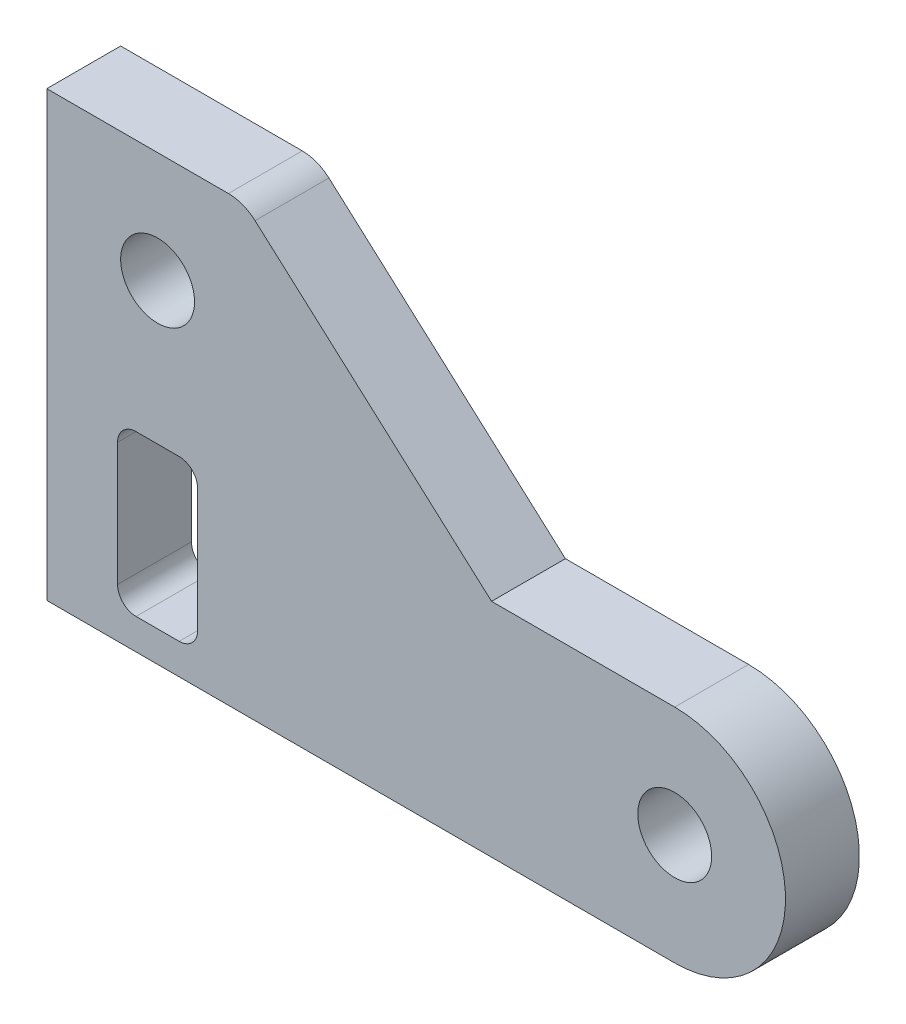
ISO-10303-21;
HEADER;
FILE_DESCRIPTION(('STEP AP214'),'2;1');
FILE_NAME('part.step','',(''),(''),'','','');
FILE_SCHEMA(('AUTOMOTIVE_DESIGN { 1 0 10303 214 1 1 1 1 }'));
ENDSEC;
DATA;
#1=APPLICATION_CONTEXT('core data for automotive mechanical design processes');
#2=APPLICATION_PROTOCOL_DEFINITION('international standard','automotive_design',2000,#1);
#3=PRODUCT_CONTEXT('',#1,'mechanical');
#4=PRODUCT('Part','Part','',(#3));
#5=PRODUCT_RELATED_PRODUCT_CATEGORY('part','',(#4));
#6=PRODUCT_DEFINITION_FORMATION('','',#4);
#7=PRODUCT_DEFINITION_CONTEXT('part definition',#1,'design');
#8=PRODUCT_DEFINITION('design','',#6,#7);
#9=PRODUCT_DEFINITION_SHAPE('','',#8);
#10=(LENGTH_UNIT() NAMED_UNIT(*) SI_UNIT(.MILLI.,.METRE.));
#11=(NAMED_UNIT(*) PLANE_ANGLE_UNIT() SI_UNIT($,.RADIAN.));
#12=(NAMED_UNIT(*) SI_UNIT($,.STERADIAN.) SOLID_ANGLE_UNIT());
#13=UNCERTAINTY_MEASURE_WITH_UNIT(LENGTH_MEASURE(1.E-05),#10,'distance_accuracy_value','');
#14=(GEOMETRIC_REPRESENTATION_CONTEXT(3) GLOBAL_UNCERTAINTY_ASSIGNED_CONTEXT((#13)) GLOBAL_UNIT_ASSIGNED_CONTEXT((#10,
#11,#12)) REPRESENTATION_CONTEXT('',''));
#15=CARTESIAN_POINT('',(0.,0.,0.));
#16=DIRECTION('',(0.,0.,1.));
#17=DIRECTION('',(1.,0.,0.));
#18=AXIS2_PLACEMENT_3D('',#15,#16,#17);
#19=CARTESIAN_POINT('',(201.0978533093,269.1465473352,3.));
#20=DIRECTION('',(0.,0.,1.));
#21=DIRECTION('',(1.,0.,0.));
#22=AXIS2_PLACEMENT_3D('',#19,#20,#21);
#23=PLANE('',#22);
#24=DIRECTION('',(1.,0.,0.));
#25=VECTOR('',#24,1.);
#26=CARTESIAN_POINT('',(179.2228533093,265.8965473352,3.));
#27=LINE('',#26,#25);
#28=CARTESIAN_POINT('',(179.2228533093,265.8965473352,3.));
#29=VERTEX_POINT('',#28);
#30=CARTESIAN_POINT('',(180.9728533093,265.8965473352,3.));
#31=VERTEX_POINT('',#30);
#32=EDGE_CURVE('E148',#29,#31,#27,.T.);
#33=ORIENTED_EDGE('',*,*,#32,.F.);
#34=CARTESIAN_POINT('',(179.2228533093,266.6465473352,3.));
#35=DIRECTION('',(0.,0.,1.));
#36=DIRECTION('',(1.,0.,0.));
#37=AXIS2_PLACEMENT_3D('',#34,#35,#36);
#38=CIRCLE('',#37,0.749999999999987);
#39=CARTESIAN_POINT('',(178.4728533093,266.6465473352,3.));
#40=VERTEX_POINT('',#39);
#41=EDGE_CURVE('E140',#40,#29,#38,.T.);
#42=ORIENTED_EDGE('',*,*,#41,.F.);
#43=DIRECTION('',(0.,-1.,0.));
#44=VECTOR('',#43,1.);
#45=CARTESIAN_POINT('',(178.4728533093,271.6465473352,3.));
#46=LINE('',#45,#44);
#47=CARTESIAN_POINT('',(178.4728533093,271.6465473352,3.));
#48=VERTEX_POINT('',#47);
#49=EDGE_CURVE('E175',#48,#40,#46,.T.);
#50=ORIENTED_EDGE('',*,*,#49,.F.);
#51=CARTESIAN_POINT('',(179.2228533093,271.6465473352,3.));
#52=DIRECTION('',(0.,0.,1.));
#53=DIRECTION('',(1.,0.,0.));
#54=AXIS2_PLACEMENT_3D('',#51,#52,#53);
#55=CIRCLE('',#54,0.750000000000015);
#56=CARTESIAN_POINT('',(179.2228533093,272.3965473352,3.));
#57=VERTEX_POINT('',#56);
#58=EDGE_CURVE('E173',#57,#48,#55,.T.);
#59=ORIENTED_EDGE('',*,*,#58,.F.);
#60=DIRECTION('',(-1.,0.,0.));
#61=VECTOR('',#60,1.);
#62=CARTESIAN_POINT('',(180.9728533093,272.3965473352,3.));
#63=LINE('',#62,#61);
#64=CARTESIAN_POINT('',(180.9728533093,272.3965473352,3.));
#65=VERTEX_POINT('',#64);
#66=EDGE_CURVE('E171',#65,#57,#63,.T.);
#67=ORIENTED_EDGE('',*,*,#66,.F.);
#68=CARTESIAN_POINT('',(180.9728533093,271.6465473352,3.));
#69=DIRECTION('',(0.,0.,1.));
#70=DIRECTION('',(1.,0.,0.));
#71=AXIS2_PLACEMENT_3D('',#68,#69,#70);
#72=CIRCLE('',#71,0.750000000000015);
#73=CARTESIAN_POINT('',(181.7228533093,271.6465473352,3.));
#74=VERTEX_POINT('',#73);
#75=EDGE_CURVE('E169',#74,#65,#72,.T.);
#76=ORIENTED_EDGE('',*,*,#75,.F.);
#77=DIRECTION('',(0.,1.,0.));
#78=VECTOR('',#77,1.);
#79=CARTESIAN_POINT('',(181.7228533093,266.6465473352,3.));
#80=LINE('',#79,#78);
#81=CARTESIAN_POINT('',(181.7228533093,266.6465473352,3.));
#82=VERTEX_POINT('',#81);
#83=EDGE_CURVE('E164',#82,#74,#80,.T.);
#84=ORIENTED_EDGE('',*,*,#83,.F.);
#85=CARTESIAN_POINT('',(180.9728533093,266.6465473352,3.));
#86=DIRECTION('',(0.,0.,1.));
#87=DIRECTION('',(1.,0.,0.));
#88=AXIS2_PLACEMENT_3D('',#85,#86,#87);
#89=CIRCLE('',#88,0.749999999999987);
#90=EDGE_CURVE('E162',#31,#82,#89,.T.);
#91=ORIENTED_EDGE('',*,*,#90,.F.);
#92=EDGE_LOOP('',(#33,#42,#50,#59,#67,#76,#84,#91));
#93=FACE_BOUND('',#92,.T.);
#94=CARTESIAN_POINT('',(201.0978533093,269.1465473352,3.));
#95=DIRECTION('',(0.,0.,1.));
#96=DIRECTION('',(1.,0.,0.));
#97=AXIS2_PLACEMENT_3D('',#94,#95,#96);
#98=CIRCLE('',#97,4.49999999999998);
#99=CARTESIAN_POINT('',(201.0978533093,264.6465473352,3.));
#100=VERTEX_POINT('',#99);
#101=CARTESIAN_POINT('',(201.0978533093,273.6465473352,3.));
#102=VERTEX_POINT('',#101);
#103=EDGE_CURVE('E214',#100,#102,#98,.T.);
#104=ORIENTED_EDGE('',*,*,#103,.T.);
#105=DIRECTION('',(-1.,0.,0.));
#106=VECTOR('',#105,1.);
#107=CARTESIAN_POINT('',(193.6603533093,273.6465473352,3.));
#108=LINE('',#107,#106);
#109=CARTESIAN_POINT('',(193.6603533093,273.6465473352,3.));
#110=VERTEX_POINT('',#109);
#111=EDGE_CURVE('E217',#102,#110,#108,.T.);
#112=ORIENTED_EDGE('',*,*,#111,.T.);
#113=DIRECTION('',(-0.745511194456907,0.666493104945157,0.));
#114=VECTOR('',#113,1.);
#115=CARTESIAN_POINT('',(184.0559046048,282.2330030262,3.));
#116=LINE('',#115,#114);
#117=CARTESIAN_POINT('',(184.0559046048,282.2330030262,3.));
#118=VERTEX_POINT('',#117);
#119=EDGE_CURVE('E220',#110,#118,#116,.T.);
#120=ORIENTED_EDGE('',*,*,#119,.T.);
#121=CARTESIAN_POINT('',(182.972853309273,281.0215473352,3.));
#122=DIRECTION('',(0.,0.,1.));
#123=DIRECTION('',(1.,0.,0.));
#124=AXIS2_PLACEMENT_3D('',#121,#122,#123);
#125=CIRCLE('',#124,1.62500000000003);
#126=CARTESIAN_POINT('',(182.9728533093,282.6465473352,3.));
#127=VERTEX_POINT('',#126);
#128=EDGE_CURVE('E222',#118,#127,#125,.T.);
#129=ORIENTED_EDGE('',*,*,#128,.T.);
#130=DIRECTION('',(-1.,0.,0.));
#131=VECTOR('',#130,1.);
#132=CARTESIAN_POINT('',(182.9728533093,282.6465473352,3.));
#133=LINE('',#132,#131);
#134=CARTESIAN_POINT('',(175.5978533093,282.6465473352,3.));
#135=VERTEX_POINT('',#134);
#136=EDGE_CURVE('E224',#127,#135,#133,.T.);
#137=ORIENTED_EDGE('',*,*,#136,.T.);
#138=DIRECTION('',(0.,-1.,0.));
#139=VECTOR('',#138,1.);
#140=CARTESIAN_POINT('',(175.5978533093,282.6465473352,3.));
#141=LINE('',#140,#139);
#142=CARTESIAN_POINT('',(175.5978533093,264.6465473352,3.));
#143=VERTEX_POINT('',#142);
#144=EDGE_CURVE('E226',#135,#143,#141,.T.);
#145=ORIENTED_EDGE('',*,*,#144,.T.);
#146=DIRECTION('',(1.,0.,0.));
#147=VECTOR('',#146,1.);
#148=CARTESIAN_POINT('',(201.0978533093,264.6465473352,3.));
#149=LINE('',#148,#147);
#150=EDGE_CURVE('E228',#143,#100,#149,.T.);
#151=ORIENTED_EDGE('',*,*,#150,.T.);
#152=EDGE_LOOP('',(#104,#112,#120,#129,#137,#145,#151));
#153=FACE_BOUND('',#152,.T.);
#154=CARTESIAN_POINT('',(201.0978533093,269.1465473352,3.));
#155=DIRECTION('',(0.,0.,1.));
#156=DIRECTION('',(1.,0.,0.));
#157=AXIS2_PLACEMENT_3D('',#154,#155,#156);
#158=CIRCLE('',#157,1.5);
#159=CARTESIAN_POINT('',(202.5978533093,269.1465473352,3.));
#160=VERTEX_POINT('',#159);
#161=EDGE_CURVE('E208',#160,#160,#158,.T.);
#162=ORIENTED_EDGE('',*,*,#161,.F.);
#163=EDGE_LOOP('',(#162));
#164=FACE_BOUND('',#163,.T.);
#165=CARTESIAN_POINT('',(180.0978533093,278.1459687639,3.));
#166=DIRECTION('',(0.,0.,1.));
#167=DIRECTION('',(1.,0.,0.));
#168=AXIS2_PLACEMENT_3D('',#165,#166,#167);
#169=CIRCLE('',#168,1.5);
#170=CARTESIAN_POINT('',(181.5978533093,278.1459687639,3.));
#171=VERTEX_POINT('',#170);
#172=EDGE_CURVE('E178',#171,#171,#169,.T.);
#173=ORIENTED_EDGE('',*,*,#172,.F.);
#174=EDGE_LOOP('',(#173));
#175=FACE_BOUND('',#174,.T.);
#176=ADVANCED_FACE('F33',(#93,#153,#164,#175),#23,.T.);
#177=CARTESIAN_POINT('',(201.0978533093,269.1465473352,0.));
#178=DIRECTION('',(0.,0.,1.));
#179=DIRECTION('',(1.,0.,0.));
#180=AXIS2_PLACEMENT_3D('',#177,#178,#179);
#181=PLANE('',#180);
#182=CARTESIAN_POINT('',(179.2228533093,266.6465473352,0.));
#183=DIRECTION('',(0.,0.,1.));
#184=DIRECTION('',(1.,0.,0.));
#185=AXIS2_PLACEMENT_3D('',#182,#183,#184);
#186=CIRCLE('',#185,0.749999999999987);
#187=CARTESIAN_POINT('',(178.4728533093,266.6465473352,0.));
#188=VERTEX_POINT('',#187);
#189=CARTESIAN_POINT('',(179.2228533093,265.8965473352,0.));
#190=VERTEX_POINT('',#189);
#191=EDGE_CURVE('E56',#188,#190,#186,.T.);
#192=ORIENTED_EDGE('',*,*,#191,.T.);
#193=DIRECTION('',(1.,0.,0.));
#194=VECTOR('',#193,1.);
#195=CARTESIAN_POINT('',(179.2228533093,265.8965473352,0.));
#196=LINE('',#195,#194);
#197=CARTESIAN_POINT('',(180.9728533093,265.8965473352,0.));
#198=VERTEX_POINT('',#197);
#199=EDGE_CURVE('E155',#190,#198,#196,.T.);
#200=ORIENTED_EDGE('',*,*,#199,.T.);
#201=CARTESIAN_POINT('',(180.9728533093,266.6465473352,0.));
#202=DIRECTION('',(0.,0.,1.));
#203=DIRECTION('',(1.,0.,0.));
#204=AXIS2_PLACEMENT_3D('',#201,#202,#203);
#205=CIRCLE('',#204,0.749999999999987);
#206=CARTESIAN_POINT('',(181.7228533093,266.6465473352,0.));
#207=VERTEX_POINT('',#206);
#208=EDGE_CURVE('E180',#198,#207,#205,.T.);
#209=ORIENTED_EDGE('',*,*,#208,.T.);
#210=DIRECTION('',(0.,1.,0.));
#211=VECTOR('',#210,1.);
#212=CARTESIAN_POINT('',(181.7228533093,266.6465473352,0.));
#213=LINE('',#212,#211);
#214=CARTESIAN_POINT('',(181.7228533093,271.6465473352,0.));
#215=VERTEX_POINT('',#214);
#216=EDGE_CURVE('E183',#207,#215,#213,.T.);
#217=ORIENTED_EDGE('',*,*,#216,.T.);
#218=CARTESIAN_POINT('',(180.9728533093,271.6465473352,0.));
#219=DIRECTION('',(0.,0.,1.));
#220=DIRECTION('',(1.,0.,0.));
#221=AXIS2_PLACEMENT_3D('',#218,#219,#220);
#222=CIRCLE('',#221,0.750000000000015);
#223=CARTESIAN_POINT('',(180.9728533093,272.3965473352,0.));
#224=VERTEX_POINT('',#223);
#225=EDGE_CURVE('E186',#215,#224,#222,.T.);
#226=ORIENTED_EDGE('',*,*,#225,.T.);
#227=DIRECTION('',(-1.,0.,0.));
#228=VECTOR('',#227,1.);
#229=CARTESIAN_POINT('',(180.9728533093,272.3965473352,0.));
#230=LINE('',#229,#228);
#231=CARTESIAN_POINT('',(179.2228533093,272.3965473352,0.));
#232=VERTEX_POINT('',#231);
#233=EDGE_CURVE('E189',#224,#232,#230,.T.);
#234=ORIENTED_EDGE('',*,*,#233,.T.);
#235=CARTESIAN_POINT('',(179.2228533093,271.6465473352,0.));
#236=DIRECTION('',(0.,0.,1.));
#237=DIRECTION('',(1.,0.,0.));
#238=AXIS2_PLACEMENT_3D('',#235,#236,#237);
#239=CIRCLE('',#238,0.750000000000015);
#240=CARTESIAN_POINT('',(178.4728533093,271.6465473352,0.));
#241=VERTEX_POINT('',#240);
#242=EDGE_CURVE('E192',#232,#241,#239,.T.);
#243=ORIENTED_EDGE('',*,*,#242,.T.);
#244=DIRECTION('',(0.,-1.,0.));
#245=VECTOR('',#244,1.);
#246=CARTESIAN_POINT('',(178.4728533093,271.6465473352,0.));
#247=LINE('',#246,#245);
#248=EDGE_CURVE('E149',#241,#188,#247,.T.);
#249=ORIENTED_EDGE('',*,*,#248,.T.);
#250=EDGE_LOOP('',(#192,#200,#209,#217,#226,#234,#243,#249));
#251=FACE_BOUND('',#250,.T.);
#252=CARTESIAN_POINT('',(201.0978533093,269.1465473352,0.));
#253=DIRECTION('',(0.,0.,1.));
#254=DIRECTION('',(1.,0.,0.));
#255=AXIS2_PLACEMENT_3D('',#252,#253,#254);
#256=CIRCLE('',#255,4.49999999999998);
#257=CARTESIAN_POINT('',(201.0978533093,264.6465473352,0.));
#258=VERTEX_POINT('',#257);
#259=CARTESIAN_POINT('',(201.0978533093,273.6465473352,0.));
#260=VERTEX_POINT('',#259);
#261=EDGE_CURVE('E211',#258,#260,#256,.T.);
#262=ORIENTED_EDGE('',*,*,#261,.F.);
#263=DIRECTION('',(1.,0.,0.));
#264=VECTOR('',#263,1.);
#265=CARTESIAN_POINT('',(201.0978533093,264.6465473352,0.));
#266=LINE('',#265,#264);
#267=CARTESIAN_POINT('',(175.5978533093,264.6465473352,0.));
#268=VERTEX_POINT('',#267);
#269=EDGE_CURVE('E218',#268,#258,#266,.T.);
#270=ORIENTED_EDGE('',*,*,#269,.F.);
#271=DIRECTION('',(0.,-1.,0.));
#272=VECTOR('',#271,1.);
#273=CARTESIAN_POINT('',(175.5978533093,282.6465473352,0.));
#274=LINE('',#273,#272);
#275=CARTESIAN_POINT('',(175.5978533093,282.6465473352,0.));
#276=VERTEX_POINT('',#275);
#277=EDGE_CURVE('E241',#276,#268,#274,.T.);
#278=ORIENTED_EDGE('',*,*,#277,.F.);
#279=DIRECTION('',(-1.,0.,0.));
#280=VECTOR('',#279,1.);
#281=CARTESIAN_POINT('',(182.9728533093,282.6465473352,0.));
#282=LINE('',#281,#280);
#283=CARTESIAN_POINT('',(182.9728533093,282.6465473352,0.));
#284=VERTEX_POINT('',#283);
#285=EDGE_CURVE('E239',#284,#276,#282,.T.);
#286=ORIENTED_EDGE('',*,*,#285,.F.);
#287=CARTESIAN_POINT('',(182.972853309273,281.0215473352,0.));
#288=DIRECTION('',(0.,0.,1.));
#289=DIRECTION('',(1.,0.,0.));
#290=AXIS2_PLACEMENT_3D('',#287,#288,#289);
#291=CIRCLE('',#290,1.62500000000003);
#292=CARTESIAN_POINT('',(184.0559046048,282.2330030262,0.));
#293=VERTEX_POINT('',#292);
#294=EDGE_CURVE('E237',#293,#284,#291,.T.);
#295=ORIENTED_EDGE('',*,*,#294,.F.);
#296=DIRECTION('',(-0.745511194456907,0.666493104945157,0.));
#297=VECTOR('',#296,1.);
#298=CARTESIAN_POINT('',(184.0559046048,282.2330030262,0.));
#299=LINE('',#298,#297);
#300=CARTESIAN_POINT('',(193.6603533093,273.6465473352,0.));
#301=VERTEX_POINT('',#300);
#302=EDGE_CURVE('E235',#301,#293,#299,.T.);
#303=ORIENTED_EDGE('',*,*,#302,.F.);
#304=DIRECTION('',(-1.,0.,0.));
#305=VECTOR('',#304,1.);
#306=CARTESIAN_POINT('',(193.6603533093,273.6465473352,0.));
#307=LINE('',#306,#305);
#308=EDGE_CURVE('E233',#260,#301,#307,.T.);
#309=ORIENTED_EDGE('',*,*,#308,.F.);
#310=EDGE_LOOP('',(#262,#270,#278,#286,#295,#303,#309));
#311=FACE_BOUND('',#310,.T.);
#312=CARTESIAN_POINT('',(201.0978533093,269.1465473352,0.));
#313=DIRECTION('',(0.,0.,1.));
#314=DIRECTION('',(1.,0.,0.));
#315=AXIS2_PLACEMENT_3D('',#312,#313,#314);
#316=CIRCLE('',#315,1.5);
#317=CARTESIAN_POINT('',(202.5978533093,269.1465473352,0.));
#318=VERTEX_POINT('',#317);
#319=EDGE_CURVE('E156',#318,#318,#316,.T.);
#320=ORIENTED_EDGE('',*,*,#319,.T.);
#321=EDGE_LOOP('',(#320));
#322=FACE_BOUND('',#321,.T.);
#323=CARTESIAN_POINT('',(180.0978533093,278.1459687639,0.));
#324=DIRECTION('',(0.,0.,1.));
#325=DIRECTION('',(1.,0.,0.));
#326=AXIS2_PLACEMENT_3D('',#323,#324,#325);
#327=CIRCLE('',#326,1.5);
#328=CARTESIAN_POINT('',(181.5978533093,278.1459687639,0.));
#329=VERTEX_POINT('',#328);
#330=EDGE_CURVE('E351',#329,#329,#327,.T.);
#331=ORIENTED_EDGE('',*,*,#330,.T.);
#332=EDGE_LOOP('',(#331));
#333=FACE_BOUND('',#332,.T.);
#334=ADVANCED_FACE('F268',(#251,#311,#322,#333),#181,.F.);
#335=CARTESIAN_POINT('',(201.0978533093,269.1465473352,3.));
#336=DIRECTION('',(0.,0.,-1.));
#337=DIRECTION('',(-1.,0.,0.));
#338=AXIS2_PLACEMENT_3D('',#335,#336,#337);
#339=CYLINDRICAL_SURFACE('',#338,4.49999999999998);
#340=ORIENTED_EDGE('',*,*,#261,.T.);
#341=DIRECTION('',(0.,0.,-1.));
#342=VECTOR('',#341,1.);
#343=CARTESIAN_POINT('',(201.0978533093,273.6465473352,3.));
#344=LINE('',#343,#342);
#345=EDGE_CURVE('E11',#102,#260,#344,.T.);
#346=ORIENTED_EDGE('',*,*,#345,.F.);
#347=ORIENTED_EDGE('',*,*,#103,.F.);
#348=DIRECTION('',(0.,0.,-1.));
#349=VECTOR('',#348,1.);
#350=CARTESIAN_POINT('',(201.0978533093,264.6465473352,3.));
#351=LINE('',#350,#349);
#352=EDGE_CURVE('E230',#100,#258,#351,.T.);
#353=ORIENTED_EDGE('',*,*,#352,.T.);
#354=EDGE_LOOP('',(#340,#346,#347,#353));
#355=FACE_BOUND('',#354,.T.);
#356=ADVANCED_FACE('F35',(#355),#339,.T.);
#357=CARTESIAN_POINT('',(193.6603533093,273.6465473352,3.));
#358=DIRECTION('',(0.,-1.,0.));
#359=DIRECTION('',(0.,0.,-1.));
#360=AXIS2_PLACEMENT_3D('',#357,#358,#359);
#361=PLANE('',#360);
#362=ORIENTED_EDGE('',*,*,#308,.T.);
#363=DIRECTION('',(0.,0.,-1.));
#364=VECTOR('',#363,1.);
#365=CARTESIAN_POINT('',(193.6603533093,273.6465473352,3.));
#366=LINE('',#365,#364);
#367=EDGE_CURVE('E41',#110,#301,#366,.T.);
#368=ORIENTED_EDGE('',*,*,#367,.F.);
#369=ORIENTED_EDGE('',*,*,#111,.F.);
#370=ORIENTED_EDGE('',*,*,#345,.T.);
#371=EDGE_LOOP('',(#362,#368,#369,#370));
#372=FACE_BOUND('',#371,.T.);
#373=ADVANCED_FACE('F285',(#372),#361,.F.);
#374=CARTESIAN_POINT('',(184.0559046048,282.2330030262,3.));
#375=DIRECTION('',(-0.666493104945157,-0.745511194456907,0.));
#376=DIRECTION('',(0.745511194456907,-0.666493104945157,0.));
#377=AXIS2_PLACEMENT_3D('',#374,#375,#376);
#378=PLANE('',#377);
#379=ORIENTED_EDGE('',*,*,#302,.T.);
#380=DIRECTION('',(0.,0.,-1.));
#381=VECTOR('',#380,1.);
#382=CARTESIAN_POINT('',(184.0559046048,282.2330030262,3.));
#383=LINE('',#382,#381);
#384=EDGE_CURVE('E255',#118,#293,#383,.T.);
#385=ORIENTED_EDGE('',*,*,#384,.F.);
#386=ORIENTED_EDGE('',*,*,#119,.F.);
#387=ORIENTED_EDGE('',*,*,#367,.T.);
#388=EDGE_LOOP('',(#379,#385,#386,#387));
#389=FACE_BOUND('',#388,.T.);
#390=ADVANCED_FACE('F262',(#389),#378,.F.);
#391=CARTESIAN_POINT('',(182.972853309273,281.0215473352,3.));
#392=DIRECTION('',(0.,0.,-1.));
#393=DIRECTION('',(-1.,0.,0.));
#394=AXIS2_PLACEMENT_3D('',#391,#392,#393);
#395=CYLINDRICAL_SURFACE('',#394,1.62500000000003);
#396=ORIENTED_EDGE('',*,*,#294,.T.);
#397=DIRECTION('',(0.,0.,-1.));
#398=VECTOR('',#397,1.);
#399=CARTESIAN_POINT('',(182.9728533093,282.6465473352,3.));
#400=LINE('',#399,#398);
#401=EDGE_CURVE('E252',#127,#284,#400,.T.);
#402=ORIENTED_EDGE('',*,*,#401,.F.);
#403=ORIENTED_EDGE('',*,*,#128,.F.);
#404=ORIENTED_EDGE('',*,*,#384,.T.);
#405=EDGE_LOOP('',(#396,#402,#403,#404));
#406=FACE_BOUND('',#405,.T.);
#407=ADVANCED_FACE('F274',(#406),#395,.T.);
#408=CARTESIAN_POINT('',(182.9728533093,282.6465473352,3.));
#409=DIRECTION('',(0.,-1.,0.));
#410=DIRECTION('',(0.,0.,-1.));
#411=AXIS2_PLACEMENT_3D('',#408,#409,#410);
#412=PLANE('',#411);
#413=ORIENTED_EDGE('',*,*,#285,.T.);
#414=DIRECTION('',(0.,0.,-1.));
#415=VECTOR('',#414,1.);
#416=CARTESIAN_POINT('',(175.5978533093,282.6465473352,3.));
#417=LINE('',#416,#415);
#418=EDGE_CURVE('E249',#135,#276,#417,.T.);
#419=ORIENTED_EDGE('',*,*,#418,.F.);
#420=ORIENTED_EDGE('',*,*,#136,.F.);
#421=ORIENTED_EDGE('',*,*,#401,.T.);
#422=EDGE_LOOP('',(#413,#419,#420,#421));
#423=FACE_BOUND('',#422,.T.);
#424=ADVANCED_FACE('F278',(#423),#412,.F.);
#425=CARTESIAN_POINT('',(175.5978533093,282.6465473352,3.));
#426=DIRECTION('',(1.,0.,0.));
#427=DIRECTION('',(0.,0.,-1.));
#428=AXIS2_PLACEMENT_3D('',#425,#426,#427);
#429=PLANE('',#428);
#430=ORIENTED_EDGE('',*,*,#277,.T.);
#431=DIRECTION('',(0.,0.,-1.));
#432=VECTOR('',#431,1.);
#433=CARTESIAN_POINT('',(175.5978533093,264.6465473352,3.));
#434=LINE('',#433,#432);
#435=EDGE_CURVE('E246',#143,#268,#434,.T.);
#436=ORIENTED_EDGE('',*,*,#435,.F.);
#437=ORIENTED_EDGE('',*,*,#144,.F.);
#438=ORIENTED_EDGE('',*,*,#418,.T.);
#439=EDGE_LOOP('',(#430,#436,#437,#438));
#440=FACE_BOUND('',#439,.T.);
#441=ADVANCED_FACE('F293',(#440),#429,.F.);
#442=CARTESIAN_POINT('',(201.0978533093,264.6465473352,3.));
#443=DIRECTION('',(0.,1.,0.));
#444=DIRECTION('',(0.,0.,1.));
#445=AXIS2_PLACEMENT_3D('',#442,#443,#444);
#446=PLANE('',#445);
#447=ORIENTED_EDGE('',*,*,#269,.T.);
#448=ORIENTED_EDGE('',*,*,#352,.F.);
#449=ORIENTED_EDGE('',*,*,#150,.F.);
#450=ORIENTED_EDGE('',*,*,#435,.T.);
#451=EDGE_LOOP('',(#447,#448,#449,#450));
#452=FACE_BOUND('',#451,.T.);
#453=ADVANCED_FACE('F290',(#452),#446,.F.);
#454=CARTESIAN_POINT('',(201.0978533093,269.1465473352,3.));
#455=DIRECTION('',(0.,0.,-1.));
#456=DIRECTION('',(-1.,0.,0.));
#457=AXIS2_PLACEMENT_3D('',#454,#455,#456);
#458=CYLINDRICAL_SURFACE('',#457,1.5);
#459=ORIENTED_EDGE('',*,*,#161,.T.);
#460=EDGE_LOOP('',(#459));
#461=FACE_BOUND('',#460,.T.);
#462=ORIENTED_EDGE('',*,*,#319,.F.);
#463=EDGE_LOOP('',(#462));
#464=FACE_BOUND('',#463,.T.);
#465=ADVANCED_FACE('F300',(#461,#464),#458,.F.);
#466=CARTESIAN_POINT('',(179.2228533093,266.6465473352,3.));
#467=DIRECTION('',(0.,0.,-1.));
#468=DIRECTION('',(-1.,0.,0.));
#469=AXIS2_PLACEMENT_3D('',#466,#467,#468);
#470=CYLINDRICAL_SURFACE('',#469,0.749999999999987);
#471=ORIENTED_EDGE('',*,*,#191,.F.);
#472=DIRECTION('',(0.,0.,-1.));
#473=VECTOR('',#472,1.);
#474=CARTESIAN_POINT('',(178.4728533093,266.6465473352,3.));
#475=LINE('',#474,#473);
#476=EDGE_CURVE('E144',#40,#188,#475,.T.);
#477=ORIENTED_EDGE('',*,*,#476,.F.);
#478=ORIENTED_EDGE('',*,*,#41,.T.);
#479=DIRECTION('',(0.,0.,-1.));
#480=VECTOR('',#479,1.);
#481=CARTESIAN_POINT('',(179.2228533093,265.8965473352,3.));
#482=LINE('',#481,#480);
#483=EDGE_CURVE('E143',#29,#190,#482,.T.);
#484=ORIENTED_EDGE('',*,*,#483,.T.);
#485=EDGE_LOOP('',(#471,#477,#478,#484));
#486=FACE_BOUND('',#485,.T.);
#487=ADVANCED_FACE('F142',(#486),#470,.F.);
#488=CARTESIAN_POINT('',(179.2228533093,265.8965473352,3.));
#489=DIRECTION('',(0.,1.,0.));
#490=DIRECTION('',(0.,0.,1.));
#491=AXIS2_PLACEMENT_3D('',#488,#489,#490);
#492=PLANE('',#491);
#493=ORIENTED_EDGE('',*,*,#199,.F.);
#494=ORIENTED_EDGE('',*,*,#483,.F.);
#495=ORIENTED_EDGE('',*,*,#32,.T.);
#496=DIRECTION('',(0.,0.,-1.));
#497=VECTOR('',#496,1.);
#498=CARTESIAN_POINT('',(180.9728533093,265.8965473352,3.));
#499=LINE('',#498,#497);
#500=EDGE_CURVE('E157',#31,#198,#499,.T.);
#501=ORIENTED_EDGE('',*,*,#500,.T.);
#502=EDGE_LOOP('',(#493,#494,#495,#501));
#503=FACE_BOUND('',#502,.T.);
#504=ADVANCED_FACE('F152',(#503),#492,.T.);
#505=CARTESIAN_POINT('',(180.9728533093,266.6465473352,3.));
#506=DIRECTION('',(0.,0.,-1.));
#507=DIRECTION('',(-1.,0.,0.));
#508=AXIS2_PLACEMENT_3D('',#505,#506,#507);
#509=CYLINDRICAL_SURFACE('',#508,0.749999999999987);
#510=ORIENTED_EDGE('',*,*,#208,.F.);
#511=ORIENTED_EDGE('',*,*,#500,.F.);
#512=ORIENTED_EDGE('',*,*,#90,.T.);
#513=DIRECTION('',(0.,0.,-1.));
#514=VECTOR('',#513,1.);
#515=CARTESIAN_POINT('',(181.7228533093,266.6465473352,3.));
#516=LINE('',#515,#514);
#517=EDGE_CURVE('E205',#82,#207,#516,.T.);
#518=ORIENTED_EDGE('',*,*,#517,.T.);
#519=EDGE_LOOP('',(#510,#511,#512,#518));
#520=FACE_BOUND('',#519,.T.);
#521=ADVANCED_FACE('F318',(#520),#509,.F.);
#522=CARTESIAN_POINT('',(181.7228533093,266.6465473352,3.));
#523=DIRECTION('',(-1.,0.,0.));
#524=DIRECTION('',(0.,0.,1.));
#525=AXIS2_PLACEMENT_3D('',#522,#523,#524);
#526=PLANE('',#525);
#527=ORIENTED_EDGE('',*,*,#216,.F.);
#528=ORIENTED_EDGE('',*,*,#517,.F.);
#529=ORIENTED_EDGE('',*,*,#83,.T.);
#530=DIRECTION('',(0.,0.,-1.));
#531=VECTOR('',#530,1.);
#532=CARTESIAN_POINT('',(181.7228533093,271.6465473352,3.));
#533=LINE('',#532,#531);
#534=EDGE_CURVE('E203',#74,#215,#533,.T.);
#535=ORIENTED_EDGE('',*,*,#534,.T.);
#536=EDGE_LOOP('',(#527,#528,#529,#535));
#537=FACE_BOUND('',#536,.T.);
#538=ADVANCED_FACE('F321',(#537),#526,.T.);
#539=CARTESIAN_POINT('',(180.9728533093,271.6465473352,3.));
#540=DIRECTION('',(0.,0.,-1.));
#541=DIRECTION('',(-1.,0.,0.));
#542=AXIS2_PLACEMENT_3D('',#539,#540,#541);
#543=CYLINDRICAL_SURFACE('',#542,0.750000000000015);
#544=ORIENTED_EDGE('',*,*,#225,.F.);
#545=ORIENTED_EDGE('',*,*,#534,.F.);
#546=ORIENTED_EDGE('',*,*,#75,.T.);
#547=DIRECTION('',(0.,0.,-1.));
#548=VECTOR('',#547,1.);
#549=CARTESIAN_POINT('',(180.9728533093,272.3965473352,3.));
#550=LINE('',#549,#548);
#551=EDGE_CURVE('E201',#65,#224,#550,.T.);
#552=ORIENTED_EDGE('',*,*,#551,.T.);
#553=EDGE_LOOP('',(#544,#545,#546,#552));
#554=FACE_BOUND('',#553,.T.);
#555=ADVANCED_FACE('F325',(#554),#543,.F.);
#556=CARTESIAN_POINT('',(180.9728533093,272.3965473352,3.));
#557=DIRECTION('',(0.,-1.,0.));
#558=DIRECTION('',(0.,0.,-1.));
#559=AXIS2_PLACEMENT_3D('',#556,#557,#558);
#560=PLANE('',#559);
#561=ORIENTED_EDGE('',*,*,#233,.F.);
#562=ORIENTED_EDGE('',*,*,#551,.F.);
#563=ORIENTED_EDGE('',*,*,#66,.T.);
#564=DIRECTION('',(0.,0.,-1.));
#565=VECTOR('',#564,1.);
#566=CARTESIAN_POINT('',(179.2228533093,272.3965473352,3.));
#567=LINE('',#566,#565);
#568=EDGE_CURVE('E199',#57,#232,#567,.T.);
#569=ORIENTED_EDGE('',*,*,#568,.T.);
#570=EDGE_LOOP('',(#561,#562,#563,#569));
#571=FACE_BOUND('',#570,.T.);
#572=ADVANCED_FACE('F329',(#571),#560,.T.);
#573=CARTESIAN_POINT('',(179.2228533093,271.6465473352,3.));
#574=DIRECTION('',(0.,0.,-1.));
#575=DIRECTION('',(-1.,0.,0.));
#576=AXIS2_PLACEMENT_3D('',#573,#574,#575);
#577=CYLINDRICAL_SURFACE('',#576,0.750000000000015);
#578=ORIENTED_EDGE('',*,*,#242,.F.);
#579=ORIENTED_EDGE('',*,*,#568,.F.);
#580=ORIENTED_EDGE('',*,*,#58,.T.);
#581=DIRECTION('',(0.,0.,-1.));
#582=VECTOR('',#581,1.);
#583=CARTESIAN_POINT('',(178.4728533093,271.6465473352,3.));
#584=LINE('',#583,#582);
#585=EDGE_CURVE('E48',#48,#241,#584,.T.);
#586=ORIENTED_EDGE('',*,*,#585,.T.);
#587=EDGE_LOOP('',(#578,#579,#580,#586));
#588=FACE_BOUND('',#587,.T.);
#589=ADVANCED_FACE('F333',(#588),#577,.F.);
#590=CARTESIAN_POINT('',(178.4728533093,271.6465473352,3.));
#591=DIRECTION('',(1.,0.,0.));
#592=DIRECTION('',(0.,0.,-1.));
#593=AXIS2_PLACEMENT_3D('',#590,#591,#592);
#594=PLANE('',#593);
#595=ORIENTED_EDGE('',*,*,#248,.F.);
#596=ORIENTED_EDGE('',*,*,#585,.F.);
#597=ORIENTED_EDGE('',*,*,#49,.T.);
#598=ORIENTED_EDGE('',*,*,#476,.T.);
#599=EDGE_LOOP('',(#595,#596,#597,#598));
#600=FACE_BOUND('',#599,.T.);
#601=ADVANCED_FACE('F337',(#600),#594,.T.);
#602=CARTESIAN_POINT('',(180.0978533093,278.1459687639,3.));
#603=DIRECTION('',(0.,0.,-1.));
#604=DIRECTION('',(-1.,0.,0.));
#605=AXIS2_PLACEMENT_3D('',#602,#603,#604);
#606=CYLINDRICAL_SURFACE('',#605,1.5);
#607=ORIENTED_EDGE('',*,*,#172,.T.);
#608=EDGE_LOOP('',(#607));
#609=FACE_BOUND('',#608,.T.);
#610=ORIENTED_EDGE('',*,*,#330,.F.);
#611=EDGE_LOOP('',(#610));
#612=FACE_BOUND('',#611,.T.);
#613=ADVANCED_FACE('F341',(#609,#612),#606,.F.);
#614=CLOSED_SHELL('',(#176,#334,#356,#373,#390,#407,#424,#441,#453,#465,#487,#504,#521,#538,
#555,#572,#589,#601,#613));
#615=MANIFOLD_SOLID_BREP('B2',#614);
#616=ADVANCED_BREP_SHAPE_REPRESENTATION('',(#18,#615),#14);
#617=SHAPE_DEFINITION_REPRESENTATION(#9,#616);
ENDSEC;
END-ISO-10303-21;
